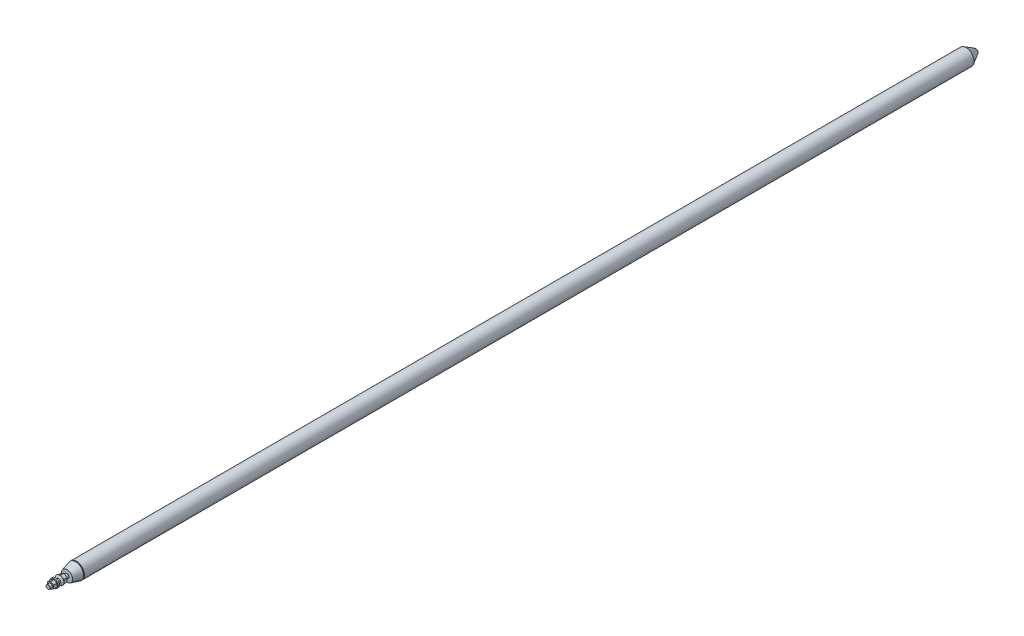
ISO-10303-21;
HEADER;
FILE_DESCRIPTION(('STEP AP214'),'2;1');
FILE_NAME('part.step','',(''),(''),'','','');
FILE_SCHEMA(('AUTOMOTIVE_DESIGN { 1 0 10303 214 1 1 1 1 }'));
ENDSEC;
DATA;
#1=APPLICATION_CONTEXT('core data for automotive mechanical design processes');
#2=APPLICATION_PROTOCOL_DEFINITION('international standard','automotive_design',2000,#1);
#3=PRODUCT_CONTEXT('',#1,'mechanical');
#4=PRODUCT('Part','Part','',(#3));
#5=PRODUCT_RELATED_PRODUCT_CATEGORY('part','',(#4));
#6=PRODUCT_DEFINITION_FORMATION('','',#4);
#7=PRODUCT_DEFINITION_CONTEXT('part definition',#1,'design');
#8=PRODUCT_DEFINITION('design','',#6,#7);
#9=PRODUCT_DEFINITION_SHAPE('','',#8);
#10=(LENGTH_UNIT() NAMED_UNIT(*) SI_UNIT(.MILLI.,.METRE.));
#11=(NAMED_UNIT(*) PLANE_ANGLE_UNIT() SI_UNIT($,.RADIAN.));
#12=(NAMED_UNIT(*) SI_UNIT($,.STERADIAN.) SOLID_ANGLE_UNIT());
#13=UNCERTAINTY_MEASURE_WITH_UNIT(LENGTH_MEASURE(1.E-05),#10,'distance_accuracy_value','');
#14=(GEOMETRIC_REPRESENTATION_CONTEXT(3) GLOBAL_UNCERTAINTY_ASSIGNED_CONTEXT((#13)) GLOBAL_UNIT_ASSIGNED_CONTEXT((#10,
#11,#12)) REPRESENTATION_CONTEXT('',''));
#15=CARTESIAN_POINT('',(0.,0.,0.));
#16=DIRECTION('',(0.,0.,1.));
#17=DIRECTION('',(1.,0.,0.));
#18=AXIS2_PLACEMENT_3D('',#15,#16,#17);
#19=CARTESIAN_POINT('',(0.,16.6751,52.1089983991226));
#20=DIRECTION('',(0.,0.,1.));
#21=DIRECTION('',(1.,0.,0.));
#22=AXIS2_PLACEMENT_3D('',#19,#20,#21);
#23=PLANE('',#22);
#24=CARTESIAN_POINT('',(0.,0.,52.1089983991226));
#25=DIRECTION('',(0.,0.,-1.));
#26=DIRECTION('',(-1.,0.,0.));
#27=AXIS2_PLACEMENT_3D('',#24,#25,#26);
#28=CIRCLE('',#27,16.6751);
#29=CARTESIAN_POINT('',(-16.6751,0.,52.1089983991226));
#30=VERTEX_POINT('',#29);
#31=EDGE_CURVE('E149',#30,#30,#28,.T.);
#32=ORIENTED_EDGE('',*,*,#31,.F.);
#33=EDGE_LOOP('',(#32));
#34=FACE_BOUND('',#33,.T.);
#35=DIRECTION('',(0.866025403784438,0.5,0.));
#36=VECTOR('',#35,1.);
#37=CARTESIAN_POINT('',(0.,-13.7554856334967,52.1089983991226));
#38=LINE('',#37,#36);
#39=CARTESIAN_POINT('',(0.,-13.7554856334967,52.1089983991226));
#40=VERTEX_POINT('',#39);
#41=CARTESIAN_POINT('',(11.9126,-6.87774281674833,52.1089983991226));
#42=VERTEX_POINT('',#41);
#43=EDGE_CURVE('E626',#40,#42,#38,.T.);
#44=ORIENTED_EDGE('',*,*,#43,.F.);
#45=DIRECTION('',(0.866025403784439,-0.499999999999999,0.));
#46=VECTOR('',#45,1.);
#47=CARTESIAN_POINT('',(-11.9126,-6.87774281674834,52.1089983991226));
#48=LINE('',#47,#46);
#49=CARTESIAN_POINT('',(-11.9126,-6.87774281674834,52.1089983991226));
#50=VERTEX_POINT('',#49);
#51=EDGE_CURVE('E147',#50,#40,#48,.T.);
#52=ORIENTED_EDGE('',*,*,#51,.F.);
#53=DIRECTION('',(0.,-1.,0.));
#54=VECTOR('',#53,1.);
#55=CARTESIAN_POINT('',(-11.9126,6.87774281674833,52.1089983991226));
#56=LINE('',#55,#54);
#57=CARTESIAN_POINT('',(-11.9126,6.87774281674833,52.1089983991226));
#58=VERTEX_POINT('',#57);
#59=EDGE_CURVE('E143',#58,#50,#56,.T.);
#60=ORIENTED_EDGE('',*,*,#59,.F.);
#61=DIRECTION('',(-0.866025403784439,-0.5,0.));
#62=VECTOR('',#61,1.);
#63=CARTESIAN_POINT('',(0.,13.7554856334967,52.1089983991226));
#64=LINE('',#63,#62);
#65=CARTESIAN_POINT('',(0.,13.7554856334967,52.1089983991226));
#66=VERTEX_POINT('',#65);
#67=EDGE_CURVE('E622',#66,#58,#64,.T.);
#68=ORIENTED_EDGE('',*,*,#67,.F.);
#69=DIRECTION('',(-0.866025403784439,0.5,0.));
#70=VECTOR('',#69,1.);
#71=CARTESIAN_POINT('',(11.9126,6.87774281674833,52.1089983991226));
#72=LINE('',#71,#70);
#73=CARTESIAN_POINT('',(11.9126,6.87774281674833,52.1089983991226));
#74=VERTEX_POINT('',#73);
#75=EDGE_CURVE('E634',#74,#66,#72,.T.);
#76=ORIENTED_EDGE('',*,*,#75,.F.);
#77=DIRECTION('',(0.,1.,0.));
#78=VECTOR('',#77,1.);
#79=CARTESIAN_POINT('',(11.9126,-6.87774281674833,52.1089983991226));
#80=LINE('',#79,#78);
#81=EDGE_CURVE('E628',#42,#74,#80,.T.);
#82=ORIENTED_EDGE('',*,*,#81,.F.);
#83=EDGE_LOOP('',(#44,#52,#60,#68,#76,#82));
#84=FACE_BOUND('',#83,.T.);
#85=ADVANCED_FACE('F33',(#34,#84),#23,.T.);
#86=CARTESIAN_POINT('',(0.,0.,0.));
#87=DIRECTION('',(0.,0.,-1.));
#88=DIRECTION('',(-1.,0.,0.));
#89=AXIS2_PLACEMENT_3D('',#86,#87,#88);
#90=CYLINDRICAL_SURFACE('',#89,7.93749999999999);
#91=CARTESIAN_POINT('',(0.,0.,46.2923983991226));
#92=DIRECTION('',(0.,0.,-1.));
#93=DIRECTION('',(-1.,0.,0.));
#94=AXIS2_PLACEMENT_3D('',#91,#92,#93);
#95=CIRCLE('',#94,7.93749999999999);
#96=CARTESIAN_POINT('',(-7.93749999999999,0.,46.2923983991226));
#97=VERTEX_POINT('',#96);
#98=EDGE_CURVE('E42',#97,#97,#95,.F.);
#99=ORIENTED_EDGE('',*,*,#98,.F.);
#100=EDGE_LOOP('',(#99));
#101=FACE_BOUND('',#100,.T.);
#102=CARTESIAN_POINT('',(0.,0.,33.5923983991226));
#103=DIRECTION('',(0.,0.,-1.));
#104=DIRECTION('',(-1.,0.,0.));
#105=AXIS2_PLACEMENT_3D('',#102,#103,#104);
#106=CIRCLE('',#105,7.93749999999999);
#107=CARTESIAN_POINT('',(0.,7.93749999999996,33.5923983991227));
#108=VERTEX_POINT('',#107);
#109=EDGE_CURVE('E236',#108,#108,#106,.T.);
#110=ORIENTED_EDGE('',*,*,#109,.F.);
#111=EDGE_LOOP('',(#110));
#112=FACE_BOUND('',#111,.T.);
#113=ADVANCED_FACE('F248',(#101,#112),#90,.T.);
#114=CARTESIAN_POINT('',(0.,0.,0.));
#115=DIRECTION('',(0.,0.,-1.));
#116=DIRECTION('',(-1.,0.,0.));
#117=AXIS2_PLACEMENT_3D('',#114,#115,#116);
#118=CIRCLE('',#117,7.93749999999999);
#119=CARTESIAN_POINT('',(-7.93749999999999,0.,0.));
#120=VERTEX_POINT('',#119);
#121=EDGE_CURVE('E224',#120,#120,#118,.T.);
#122=ORIENTED_EDGE('',*,*,#121,.F.);
#123=EDGE_LOOP('',(#122));
#124=FACE_BOUND('',#123,.T.);
#125=CARTESIAN_POINT('',(0.,0.,12.690475));
#126=DIRECTION('',(0.,0.,1.));
#127=DIRECTION('',(1.,0.,0.));
#128=AXIS2_PLACEMENT_3D('',#125,#126,#127);
#129=CIRCLE('',#128,7.93749999999999);
#130=CARTESIAN_POINT('',(7.93749999999999,0.,12.690475));
#131=VERTEX_POINT('',#130);
#132=EDGE_CURVE('E201',#131,#131,#129,.F.);
#133=ORIENTED_EDGE('',*,*,#132,.T.);
#134=EDGE_LOOP('',(#133));
#135=FACE_BOUND('',#134,.T.);
#136=ADVANCED_FACE('F251',(#124,#135),#90,.T.);
#137=CARTESIAN_POINT('',(0.,0.,-38.1));
#138=DIRECTION('',(0.,0.,1.));
#139=DIRECTION('',(1.,0.,0.));
#140=AXIS2_PLACEMENT_3D('',#137,#138,#139);
#141=CONICAL_SURFACE('',#140,28.575,0.780728808749583);
#142=CARTESIAN_POINT('',(0.,0.,-34.8952102827305));
#143=DIRECTION('',(0.,0.,-1.));
#144=DIRECTION('',(-1.,0.,0.));
#145=AXIS2_PLACEMENT_3D('',#142,#143,#144);
#146=CIRCLE('',#145,31.75);
#147=CARTESIAN_POINT('',(-31.75,0.,-34.8952102827305));
#148=VERTEX_POINT('',#147);
#149=EDGE_CURVE('E230',#148,#148,#146,.T.);
#150=ORIENTED_EDGE('',*,*,#149,.T.);
#151=EDGE_LOOP('',(#150));
#152=FACE_BOUND('',#151,.T.);
#153=CARTESIAN_POINT('',(0.,0.,-38.1));
#154=DIRECTION('',(0.,0.,-1.));
#155=DIRECTION('',(-1.,0.,0.));
#156=AXIS2_PLACEMENT_3D('',#153,#154,#155);
#157=CIRCLE('',#156,28.575);
#158=CARTESIAN_POINT('',(-28.575,0.,-38.1));
#159=VERTEX_POINT('',#158);
#160=EDGE_CURVE('E233',#159,#159,#157,.T.);
#161=ORIENTED_EDGE('',*,*,#160,.F.);
#162=EDGE_LOOP('',(#161));
#163=FACE_BOUND('',#162,.T.);
#164=ADVANCED_FACE('F454',(#152,#163),#141,.T.);
#165=CARTESIAN_POINT('',(0.,0.,-34.8952102827305));
#166=DIRECTION('',(0.,0.,-1.));
#167=DIRECTION('',(-1.,0.,0.));
#168=AXIS2_PLACEMENT_3D('',#165,#166,#167);
#169=CONICAL_SURFACE('',#168,31.75,0.266468742447018);
#170=CARTESIAN_POINT('',(0.,0.,0.));
#171=DIRECTION('',(0.,0.,-1.));
#172=DIRECTION('',(-1.,0.,0.));
#173=AXIS2_PLACEMENT_3D('',#170,#171,#172);
#174=CIRCLE('',#173,22.225);
#175=CARTESIAN_POINT('',(-22.225,0.,0.));
#176=VERTEX_POINT('',#175);
#177=EDGE_CURVE('E227',#176,#176,#174,.T.);
#178=ORIENTED_EDGE('',*,*,#177,.T.);
#179=EDGE_LOOP('',(#178));
#180=FACE_BOUND('',#179,.T.);
#181=ORIENTED_EDGE('',*,*,#149,.F.);
#182=EDGE_LOOP('',(#181));
#183=FACE_BOUND('',#182,.T.);
#184=ADVANCED_FACE('F540',(#180,#183),#169,.T.);
#185=CARTESIAN_POINT('',(0.,7.93749999999999,0.));
#186=DIRECTION('',(0.,0.,1.));
#187=DIRECTION('',(1.,0.,0.));
#188=AXIS2_PLACEMENT_3D('',#185,#186,#187);
#189=PLANE('',#188);
#190=ORIENTED_EDGE('',*,*,#121,.T.);
#191=EDGE_LOOP('',(#190));
#192=FACE_BOUND('',#191,.T.);
#193=ORIENTED_EDGE('',*,*,#177,.F.);
#194=EDGE_LOOP('',(#193));
#195=FACE_BOUND('',#194,.T.);
#196=ADVANCED_FACE('F527',(#192,#195),#189,.T.);
#197=CARTESIAN_POINT('',(0.,31.75,-38.1));
#198=DIRECTION('',(0.,0.,-1.));
#199=DIRECTION('',(-1.,0.,0.));
#200=AXIS2_PLACEMENT_3D('',#197,#198,#199);
#201=PLANE('',#200);
#202=ORIENTED_EDGE('',*,*,#160,.T.);
#203=EDGE_LOOP('',(#202));
#204=FACE_BOUND('',#203,.T.);
#205=CARTESIAN_POINT('',(0.,0.,-38.1));
#206=DIRECTION('',(0.,0.,1.));
#207=DIRECTION('',(1.,0.,0.));
#208=AXIS2_PLACEMENT_3D('',#205,#206,#207);
#209=CIRCLE('',#208,31.75);
#210=CARTESIAN_POINT('',(31.75,0.,-38.1));
#211=VERTEX_POINT('',#210);
#212=EDGE_CURVE('E205',#211,#211,#209,.T.);
#213=ORIENTED_EDGE('',*,*,#212,.T.);
#214=EDGE_LOOP('',(#213));
#215=FACE_BOUND('',#214,.T.);
#216=ADVANCED_FACE('F523',(#204,#215),#201,.F.);
#217=CARTESIAN_POINT('',(0.,0.,29.7434));
#218=DIRECTION('',(0.,0.,1.));
#219=DIRECTION('',(1.,0.,0.));
#220=AXIS2_PLACEMENT_3D('',#217,#218,#219);
#221=CYLINDRICAL_SURFACE('',#220,31.75);
#222=ORIENTED_EDGE('',*,*,#212,.F.);
#223=EDGE_LOOP('',(#222));
#224=FACE_BOUND('',#223,.T.);
#225=CARTESIAN_POINT('',(0.,0.,-3603.43540844997));
#226=DIRECTION('',(0.,0.,1.));
#227=DIRECTION('',(1.,0.,0.));
#228=AXIS2_PLACEMENT_3D('',#225,#226,#227);
#229=CIRCLE('',#228,31.75);
#230=CARTESIAN_POINT('',(31.75,0.,-3603.43540844997));
#231=VERTEX_POINT('',#230);
#232=EDGE_CURVE('E208',#231,#231,#229,.T.);
#233=ORIENTED_EDGE('',*,*,#232,.T.);
#234=EDGE_LOOP('',(#233));
#235=FACE_BOUND('',#234,.T.);
#236=ADVANCED_FACE('F526',(#224,#235),#221,.T.);
#237=CARTESIAN_POINT('',(0.,0.,-3639.37802159028));
#238=DIRECTION('',(0.,0.,1.));
#239=DIRECTION('',(1.,0.,0.));
#240=AXIS2_PLACEMENT_3D('',#237,#238,#239);
#241=CONICAL_SURFACE('',#240,10.9985226280624,0.523598775598293);
#242=ORIENTED_EDGE('',*,*,#232,.F.);
#243=EDGE_LOOP('',(#242));
#244=FACE_BOUND('',#243,.T.);
#245=CARTESIAN_POINT('',(0.,0.,-3639.37802159028));
#246=DIRECTION('',(0.,0.,1.));
#247=DIRECTION('',(1.,0.,0.));
#248=AXIS2_PLACEMENT_3D('',#245,#246,#247);
#249=CIRCLE('',#248,10.9985226280624);
#250=CARTESIAN_POINT('',(10.9985226280624,0.,-3639.37802159028));
#251=VERTEX_POINT('',#250);
#252=EDGE_CURVE('E211',#251,#251,#249,.T.);
#253=ORIENTED_EDGE('',*,*,#252,.T.);
#254=EDGE_LOOP('',(#253));
#255=FACE_BOUND('',#254,.T.);
#256=ADVANCED_FACE('F531',(#244,#255),#241,.T.);
#257=CARTESIAN_POINT('',(0.,0.,-3633.02802159028));
#258=DIRECTION('',(0.,0.,1.));
#259=DIRECTION('',(0.,1.,0.));
#260=AXIS2_PLACEMENT_3D('',#257,#258,#259);
#261=SPHERICAL_SURFACE('',#260,12.7000000000001);
#262=ORIENTED_EDGE('',*,*,#252,.F.);
#263=EDGE_LOOP('',(#262));
#264=FACE_BOUND('',#263,.T.);
#265=ADVANCED_FACE('F464',(#264),#261,.T.);
#266=CARTESIAN_POINT('',(13.5001,-7.79428636908687,12.690475));
#267=DIRECTION('',(-0.499999999999999,0.866025403784439,0.));
#268=DIRECTION('',(-0.866025403784439,-0.5,0.));
#269=AXIS2_PLACEMENT_3D('',#266,#267,#268);
#270=PLANE('',#269);
#271=DIRECTION('',(-0.866025403784439,-0.499999999999999,0.));
#272=VECTOR('',#271,1.);
#273=CARTESIAN_POINT('',(13.5001,-7.79428636908687,28.1686));
#274=LINE('',#273,#272);
#275=CARTESIAN_POINT('',(13.5001,-7.79428636908687,28.1686));
#276=VERTEX_POINT('',#275);
#277=CARTESIAN_POINT('',(0.,-15.5885727381737,28.1686));
#278=VERTEX_POINT('',#277);
#279=EDGE_CURVE('E160',#276,#278,#274,.T.);
#280=ORIENTED_EDGE('',*,*,#279,.T.);
#281=DIRECTION('',(0.,0.,1.));
#282=VECTOR('',#281,1.);
#283=CARTESIAN_POINT('',(0.,-15.5885727381737,12.690475));
#284=LINE('',#283,#282);
#285=CARTESIAN_POINT('',(0.,-15.5885727381737,12.690475));
#286=VERTEX_POINT('',#285);
#287=EDGE_CURVE('E199',#286,#278,#284,.T.);
#288=ORIENTED_EDGE('',*,*,#287,.F.);
#289=DIRECTION('',(-0.866025403784439,-0.499999999999999,0.));
#290=VECTOR('',#289,1.);
#291=CARTESIAN_POINT('',(13.5001,-7.79428636908687,12.690475));
#292=LINE('',#291,#290);
#293=CARTESIAN_POINT('',(13.5001,-7.79428636908687,12.690475));
#294=VERTEX_POINT('',#293);
#295=EDGE_CURVE('E161',#294,#286,#292,.T.);
#296=ORIENTED_EDGE('',*,*,#295,.F.);
#297=DIRECTION('',(0.,0.,1.));
#298=VECTOR('',#297,1.);
#299=CARTESIAN_POINT('',(13.5001,-7.79428636908687,12.690475));
#300=LINE('',#299,#298);
#301=EDGE_CURVE('E175',#294,#276,#300,.T.);
#302=ORIENTED_EDGE('',*,*,#301,.T.);
#303=EDGE_LOOP('',(#280,#288,#296,#302));
#304=FACE_BOUND('',#303,.T.);
#305=ADVANCED_FACE('F292',(#304),#270,.F.);
#306=CARTESIAN_POINT('',(0.,-15.5885727381737,12.690475));
#307=DIRECTION('',(0.5,0.866025403784438,0.));
#308=DIRECTION('',(-0.866025403784438,0.5,0.));
#309=AXIS2_PLACEMENT_3D('',#306,#307,#308);
#310=PLANE('',#309);
#311=DIRECTION('',(-0.866025403784438,0.5,0.));
#312=VECTOR('',#311,1.);
#313=CARTESIAN_POINT('',(0.,-15.5885727381737,28.1686));
#314=LINE('',#313,#312);
#315=CARTESIAN_POINT('',(-13.5001,-7.79428636908686,28.1686));
#316=VERTEX_POINT('',#315);
#317=EDGE_CURVE('E178',#278,#316,#314,.T.);
#318=ORIENTED_EDGE('',*,*,#317,.T.);
#319=DIRECTION('',(0.,0.,1.));
#320=VECTOR('',#319,1.);
#321=CARTESIAN_POINT('',(-13.5001,-7.79428636908686,12.690475));
#322=LINE('',#321,#320);
#323=CARTESIAN_POINT('',(-13.5001,-7.79428636908686,12.690475));
#324=VERTEX_POINT('',#323);
#325=EDGE_CURVE('E196',#324,#316,#322,.T.);
#326=ORIENTED_EDGE('',*,*,#325,.F.);
#327=DIRECTION('',(-0.866025403784438,0.5,0.));
#328=VECTOR('',#327,1.);
#329=CARTESIAN_POINT('',(0.,-15.5885727381737,12.690475));
#330=LINE('',#329,#328);
#331=EDGE_CURVE('E164',#286,#324,#330,.T.);
#332=ORIENTED_EDGE('',*,*,#331,.F.);
#333=ORIENTED_EDGE('',*,*,#287,.T.);
#334=EDGE_LOOP('',(#318,#326,#332,#333));
#335=FACE_BOUND('',#334,.T.);
#336=ADVANCED_FACE('F280',(#335),#310,.F.);
#337=CARTESIAN_POINT('',(-13.5001,-7.79428636908686,12.690475));
#338=DIRECTION('',(1.,0.,0.));
#339=DIRECTION('',(0.,1.,0.));
#340=AXIS2_PLACEMENT_3D('',#337,#338,#339);
#341=PLANE('',#340);
#342=DIRECTION('',(0.,1.,0.));
#343=VECTOR('',#342,1.);
#344=CARTESIAN_POINT('',(-13.5001,-7.79428636908686,28.1686));
#345=LINE('',#344,#343);
#346=CARTESIAN_POINT('',(-13.5001,7.79428636908686,28.1686));
#347=VERTEX_POINT('',#346);
#348=EDGE_CURVE('E180',#316,#347,#345,.T.);
#349=ORIENTED_EDGE('',*,*,#348,.T.);
#350=DIRECTION('',(0.,0.,1.));
#351=VECTOR('',#350,1.);
#352=CARTESIAN_POINT('',(-13.5001,7.79428636908686,12.690475));
#353=LINE('',#352,#351);
#354=CARTESIAN_POINT('',(-13.5001,7.79428636908686,12.690475));
#355=VERTEX_POINT('',#354);
#356=EDGE_CURVE('E193',#355,#347,#353,.T.);
#357=ORIENTED_EDGE('',*,*,#356,.F.);
#358=DIRECTION('',(0.,1.,0.));
#359=VECTOR('',#358,1.);
#360=CARTESIAN_POINT('',(-13.5001,-7.79428636908686,12.690475));
#361=LINE('',#360,#359);
#362=EDGE_CURVE('E167',#324,#355,#361,.T.);
#363=ORIENTED_EDGE('',*,*,#362,.F.);
#364=ORIENTED_EDGE('',*,*,#325,.T.);
#365=EDGE_LOOP('',(#349,#357,#363,#364));
#366=FACE_BOUND('',#365,.T.);
#367=ADVANCED_FACE('F284',(#366),#341,.F.);
#368=CARTESIAN_POINT('',(-13.5001,7.79428636908686,12.690475));
#369=DIRECTION('',(0.5,-0.866025403784439,0.));
#370=DIRECTION('',(0.866025403784439,0.5,0.));
#371=AXIS2_PLACEMENT_3D('',#368,#369,#370);
#372=PLANE('',#371);
#373=DIRECTION('',(0.866025403784439,0.5,0.));
#374=VECTOR('',#373,1.);
#375=CARTESIAN_POINT('',(-13.5001,7.79428636908686,28.1686));
#376=LINE('',#375,#374);
#377=CARTESIAN_POINT('',(0.,15.5885727381737,28.1686));
#378=VERTEX_POINT('',#377);
#379=EDGE_CURVE('E182',#347,#378,#376,.T.);
#380=ORIENTED_EDGE('',*,*,#379,.T.);
#381=DIRECTION('',(0.,0.,1.));
#382=VECTOR('',#381,1.);
#383=CARTESIAN_POINT('',(0.,15.5885727381737,12.690475));
#384=LINE('',#383,#382);
#385=CARTESIAN_POINT('',(0.,15.5885727381737,12.690475));
#386=VERTEX_POINT('',#385);
#387=EDGE_CURVE('E190',#386,#378,#384,.T.);
#388=ORIENTED_EDGE('',*,*,#387,.F.);
#389=DIRECTION('',(0.866025403784439,0.5,0.));
#390=VECTOR('',#389,1.);
#391=CARTESIAN_POINT('',(-13.5001,7.79428636908686,12.690475));
#392=LINE('',#391,#390);
#393=EDGE_CURVE('E169',#355,#386,#392,.T.);
#394=ORIENTED_EDGE('',*,*,#393,.F.);
#395=ORIENTED_EDGE('',*,*,#356,.T.);
#396=EDGE_LOOP('',(#380,#388,#394,#395));
#397=FACE_BOUND('',#396,.T.);
#398=ADVANCED_FACE('F299',(#397),#372,.F.);
#399=CARTESIAN_POINT('',(0.,15.5885727381737,12.690475));
#400=DIRECTION('',(-0.5,-0.866025403784438,0.));
#401=DIRECTION('',(0.866025403784439,-0.5,0.));
#402=AXIS2_PLACEMENT_3D('',#399,#400,#401);
#403=PLANE('',#402);
#404=DIRECTION('',(0.866025403784438,-0.5,0.));
#405=VECTOR('',#404,1.);
#406=CARTESIAN_POINT('',(0.,15.5885727381737,28.1686));
#407=LINE('',#406,#405);
#408=CARTESIAN_POINT('',(13.5001,7.79428636908686,28.1686));
#409=VERTEX_POINT('',#408);
#410=EDGE_CURVE('E184',#378,#409,#407,.T.);
#411=ORIENTED_EDGE('',*,*,#410,.T.);
#412=DIRECTION('',(0.,0.,1.));
#413=VECTOR('',#412,1.);
#414=CARTESIAN_POINT('',(13.5001,7.79428636908686,12.690475));
#415=LINE('',#414,#413);
#416=CARTESIAN_POINT('',(13.5001,7.79428636908686,12.690475));
#417=VERTEX_POINT('',#416);
#418=EDGE_CURVE('E57',#417,#409,#415,.T.);
#419=ORIENTED_EDGE('',*,*,#418,.F.);
#420=DIRECTION('',(0.866025403784438,-0.5,0.));
#421=VECTOR('',#420,1.);
#422=CARTESIAN_POINT('',(0.,15.5885727381737,12.690475));
#423=LINE('',#422,#421);
#424=EDGE_CURVE('E171',#386,#417,#423,.T.);
#425=ORIENTED_EDGE('',*,*,#424,.F.);
#426=ORIENTED_EDGE('',*,*,#387,.T.);
#427=EDGE_LOOP('',(#411,#419,#425,#426));
#428=FACE_BOUND('',#427,.T.);
#429=ADVANCED_FACE('F296',(#428),#403,.F.);
#430=CARTESIAN_POINT('',(13.5001,7.79428636908686,12.690475));
#431=DIRECTION('',(-1.,0.,0.));
#432=DIRECTION('',(0.,0.,1.));
#433=AXIS2_PLACEMENT_3D('',#430,#431,#432);
#434=PLANE('',#433);
#435=DIRECTION('',(0.,-1.,0.));
#436=VECTOR('',#435,1.);
#437=CARTESIAN_POINT('',(13.5001,7.79428636908686,28.1686));
#438=LINE('',#437,#436);
#439=EDGE_CURVE('E165',#409,#276,#438,.T.);
#440=ORIENTED_EDGE('',*,*,#439,.T.);
#441=ORIENTED_EDGE('',*,*,#301,.F.);
#442=DIRECTION('',(0.,-1.,0.));
#443=VECTOR('',#442,1.);
#444=CARTESIAN_POINT('',(13.5001,7.79428636908686,12.690475));
#445=LINE('',#444,#443);
#446=EDGE_CURVE('E173',#417,#294,#445,.T.);
#447=ORIENTED_EDGE('',*,*,#446,.F.);
#448=ORIENTED_EDGE('',*,*,#418,.T.);
#449=EDGE_LOOP('',(#440,#441,#447,#448));
#450=FACE_BOUND('',#449,.T.);
#451=ADVANCED_FACE('F293',(#450),#434,.F.);
#452=CARTESIAN_POINT('',(13.5001,-7.79428636908687,12.690475));
#453=DIRECTION('',(0.,0.,1.));
#454=DIRECTION('',(1.,0.,0.));
#455=AXIS2_PLACEMENT_3D('',#452,#453,#454);
#456=PLANE('',#455);
#457=ORIENTED_EDGE('',*,*,#132,.F.);
#458=EDGE_LOOP('',(#457));
#459=FACE_BOUND('',#458,.T.);
#460=ORIENTED_EDGE('',*,*,#295,.T.);
#461=ORIENTED_EDGE('',*,*,#331,.T.);
#462=ORIENTED_EDGE('',*,*,#362,.T.);
#463=ORIENTED_EDGE('',*,*,#393,.T.);
#464=ORIENTED_EDGE('',*,*,#424,.T.);
#465=ORIENTED_EDGE('',*,*,#446,.T.);
#466=EDGE_LOOP('',(#460,#461,#462,#463,#464,#465));
#467=FACE_BOUND('',#466,.T.);
#468=ADVANCED_FACE('F260',(#459,#467),#456,.F.);
#469=CARTESIAN_POINT('',(0.,0.,0.0435161764705885));
#470=DIRECTION('',(0.,0.,-1.));
#471=DIRECTION('',(0.,1.,0.));
#472=AXIS2_PLACEMENT_3D('',#469,#470,#471);
#473=SPHERICAL_SURFACE('',#472,34.4750838235294);
#474=CARTESIAN_POINT('',(0.,0.,29.7688));
#475=DIRECTION('',(0.,0.,-1.));
#476=DIRECTION('',(-1.,0.,0.));
#477=AXIS2_PLACEMENT_3D('',#474,#475,#476);
#478=CIRCLE('',#477,17.4625);
#479=CARTESIAN_POINT('',(0.,17.4625,29.7688));
#480=VERTEX_POINT('',#479);
#481=EDGE_CURVE('E215',#480,#480,#478,.T.);
#482=CARTESIAN_POINT('',(0.,7.93749999999996,33.5923983991227));
#483=CARTESIAN_POINT('',(0.,8.04193033230631,33.5676907138939));
#484=CARTESIAN_POINT('',(0.,8.14624529277318,33.5424953955937));
#485=CARTESIAN_POINT('',(0.,8.35463538983752,33.4911317569022));
#486=CARTESIAN_POINT('',(0.,8.458710526435,33.464963436511));
#487=CARTESIAN_POINT('',(0.,8.66661189557016,33.4116560576896));
#488=CARTESIAN_POINT('',(0.,8.77043812810784,33.3845169992594));
#489=CARTESIAN_POINT('',(0.,8.97783263624223,33.3292705157999));
#490=CARTESIAN_POINT('',(0.,9.08140091183892,33.3011630907704));
#491=CARTESIAN_POINT('',(0.,9.28827047420351,33.2439823239056));
#492=CARTESIAN_POINT('',(0.,9.39157176097139,33.2149089820701));
#493=CARTESIAN_POINT('',(0.,9.59789833747534,33.1557989172506));
#494=CARTESIAN_POINT('',(0.,9.7009236272114,33.1257621942665));
#495=CARTESIAN_POINT('',(0.,9.90668922540895,33.0647279863804));
#496=CARTESIAN_POINT('',(0.,10.0094295338704,33.0337305014784));
#497=CARTESIAN_POINT('',(0.,10.2146162101565,32.9707774728867));
#498=CARTESIAN_POINT('',(0.,10.3170625779811,32.938821929197));
#499=CARTESIAN_POINT('',(0.,10.521652439256,32.8739555696753));
#500=CARTESIAN_POINT('',(0.,10.6237959327063,32.8410447538433));
#501=CARTESIAN_POINT('',(0.,10.8277711379095,32.7742707199945));
#502=CARTESIAN_POINT('',(0.,10.9296028496623,32.7404075019776));
#503=CARTESIAN_POINT('',(0.,11.132945611335,32.6717316167674));
#504=CARTESIAN_POINT('',(0.,11.234456661255,32.636918949574));
#505=CARTESIAN_POINT('',(0.,11.4371492470899,32.5663472018157));
#506=CARTESIAN_POINT('',(0.,11.5383307830049,32.5305881212508));
#507=CARTESIAN_POINT('',(0.,11.7403555173927,32.458126665085));
#508=CARTESIAN_POINT('',(0.,11.8411987158655,32.4214242894841));
#509=CARTESIAN_POINT('',(0.,12.042537981436,32.3470794438415));
#510=CARTESIAN_POINT('',(0.,12.1430340485337,32.3094369737997));
#511=CARTESIAN_POINT('',(0.,12.3436702876927,32.2332152218499));
#512=CARTESIAN_POINT('',(0.,12.4438104597538,32.194635939942));
#513=CARTESIAN_POINT('',(0.,12.6437261762134,32.1165439285288));
#514=CARTESIAN_POINT('',(0.,12.7435017206118,32.0770311990235));
#515=CARTESIAN_POINT('',(0.,12.9426794809169,31.9970757380846));
#516=CARTESIAN_POINT('',(0.,13.0420816968236,31.956633006651));
#517=CARTESIAN_POINT('',(0.,13.2405041318717,31.8748210686243));
#518=CARTESIAN_POINT('',(0.,13.3395243510132,31.8334518620313));
#519=CARTESIAN_POINT('',(0.,13.5371741575694,31.7497905812473));
#520=CARTESIAN_POINT('',(0.,13.6358037449841,31.7074985070563));
#521=CARTESIAN_POINT('',(0.,13.8326636871895,31.6219951791153));
#522=CARTESIAN_POINT('',(0.,13.9308940419803,31.5787839253653));
#523=CARTESIAN_POINT('',(0.,14.1269469528556,31.4914460065018));
#524=CARTESIAN_POINT('',(0.,14.2247695089402,31.4473193413882));
#525=CARTESIAN_POINT('',(0.,14.4199982918825,31.3581544478201));
#526=CARTESIAN_POINT('',(0.,14.5174045187402,31.3131162193657));
#527=CARTESIAN_POINT('',(0.,14.7117921490136,31.2221321266308));
#528=CARTESIAN_POINT('',(0.,14.8087735524293,31.1761862623503));
#529=CARTESIAN_POINT('',(0.,15.0023030786502,31.0833909046278));
#530=CARTESIAN_POINT('',(0.,15.0988512014553,31.0365414111859));
#531=CARTESIAN_POINT('',(0.,15.2915057470694,30.9419428806036));
#532=CARTESIAN_POINT('',(0.,15.3876121698782,30.8941938434631));
#533=CARTESIAN_POINT('',(0.,15.579374934636,30.7978003893978));
#534=CARTESIAN_POINT('',(0.,15.675031276585,30.749155972473));
#535=CARTESIAN_POINT('',(0.,15.8658855379922,30.6509760008058));
#536=CARTESIAN_POINT('',(0.,15.9610834574505,30.6014404460634));
#537=CARTESIAN_POINT('',(0.,16.1510125722821,30.5014825185434));
#538=CARTESIAN_POINT('',(0.,16.2457437676554,30.4510601457658));
#539=CARTESIAN_POINT('',(0.,16.4347311731984,30.3493329789012));
#540=CARTESIAN_POINT('',(0.,16.5289873833681,30.2980281848143));
#541=CARTESIAN_POINT('',(0.,16.7170165996438,30.194540650465));
#542=CARTESIAN_POINT('',(0.,16.8107896057498,30.1423579102026));
#543=CARTESIAN_POINT('',(0.,16.9978442340481,30.0371190297578));
#544=CARTESIAN_POINT('',(0.,17.0911258562404,29.9840628895754));
#545=CARTESIAN_POINT('',(0.,17.2771895913833,29.877081852009));
#546=CARTESIAN_POINT('',(0.,17.369971704334,29.8231569546252));
#547=CARTESIAN_POINT('',(0.,17.4625,29.7688));
#548=B_SPLINE_CURVE_WITH_KNOTS('',3,(#482,#483,#484,#485,#486,#487,#488,#489,#490,#491,#492,
#493,#494,#495,#496,#497,#498,#499,#500,#501,#502,#503,#504,#505,#506,#507,#508,#509,#510,#511,
#512,#513,#514,#515,#516,#517,#518,#519,#520,#521,#522,#523,#524,#525,#526,#527,#528,#529,#530,
#531,#532,#533,#534,#535,#536,#537,#538,#539,#540,#541,#542,#543,#544,#545,#546,#547),
.UNSPECIFIED.,.F.,.F.,(4,2,2,2,2,2,2,2,2,2,2,2,2,2,2,2,2,2,2,2,2,2,2,2,2,2,2,2,2,2,2,2,4),(0.,
0.321939004572816,0.643878009145632,0.965817013718447,1.28775601829126,1.60969502286408,
1.9316340274369,2.25357303200971,2.57551203658253,2.89745104115534,3.21939004572815,
3.54132905030097,3.86326805487378,4.1852070594466,4.50714606401941,4.82908506859223,
5.15102407316505,5.47296307773786,5.79490208231068,6.11684108688349,6.43878009145631,
6.76071909602913,7.08265810060194,7.40459710517475,7.72653610974757,8.04847511432038,
8.3704141188932,8.69235312346602,9.01429212803883,9.33623113261165,9.65817013718446,
9.98010914175728,10.3020481463301),.UNSPECIFIED.);
#549=EDGE_CURVE('BSEAM256',#108,#480,#548,.T.);
#550=ORIENTED_EDGE('',*,*,#109,.T.);
#551=ORIENTED_EDGE('',*,*,#481,.F.);
#552=ORIENTED_EDGE('',*,*,#549,.T.);
#553=ORIENTED_EDGE('',*,*,#549,.F.);
#554=EDGE_LOOP('',(#550,#552,#551,#553));
#555=FACE_BOUND('',#554,.T.);
#556=ADVANCED_FACE('F256',(#555),#473,.T.);
#557=CARTESIAN_POINT('',(0.,0.,0.));
#558=DIRECTION('',(0.,0.,-1.));
#559=DIRECTION('',(-1.,0.,0.));
#560=AXIS2_PLACEMENT_3D('',#557,#558,#559);
#561=CYLINDRICAL_SURFACE('',#560,17.4625);
#562=ORIENTED_EDGE('',*,*,#481,.T.);
#563=EDGE_LOOP('',(#562));
#564=FACE_BOUND('',#563,.T.);
#565=CARTESIAN_POINT('',(0.,0.,28.1686));
#566=DIRECTION('',(0.,0.,-1.));
#567=DIRECTION('',(-1.,0.,0.));
#568=AXIS2_PLACEMENT_3D('',#565,#566,#567);
#569=CIRCLE('',#568,17.4625);
#570=CARTESIAN_POINT('',(-17.4625,0.,28.1686));
#571=VERTEX_POINT('',#570);
#572=EDGE_CURVE('E218',#571,#571,#569,.T.);
#573=ORIENTED_EDGE('',*,*,#572,.F.);
#574=EDGE_LOOP('',(#573));
#575=FACE_BOUND('',#574,.T.);
#576=ADVANCED_FACE('F259',(#564,#575),#561,.T.);
#577=CARTESIAN_POINT('',(0.,0.,28.1686));
#578=DIRECTION('',(0.,0.,-1.));
#579=DIRECTION('',(-1.,0.,0.));
#580=AXIS2_PLACEMENT_3D('',#577,#578,#579);
#581=PLANE('',#580);
#582=ORIENTED_EDGE('',*,*,#572,.T.);
#583=EDGE_LOOP('',(#582));
#584=FACE_BOUND('',#583,.T.);
#585=ORIENTED_EDGE('',*,*,#317,.F.);
#586=ORIENTED_EDGE('',*,*,#279,.F.);
#587=ORIENTED_EDGE('',*,*,#439,.F.);
#588=ORIENTED_EDGE('',*,*,#410,.F.);
#589=ORIENTED_EDGE('',*,*,#379,.F.);
#590=ORIENTED_EDGE('',*,*,#348,.F.);
#591=EDGE_LOOP('',(#585,#586,#587,#588,#589,#590));
#592=FACE_BOUND('',#591,.T.);
#593=ADVANCED_FACE('F266',(#584,#592),#581,.T.);
#594=CARTESIAN_POINT('',(0.,0.,46.2923983991226));
#595=DIRECTION('',(0.,0.,-1.));
#596=DIRECTION('',(-1.,0.,0.));
#597=AXIS2_PLACEMENT_3D('',#594,#595,#596);
#598=PLANE('',#597);
#599=ORIENTED_EDGE('',*,*,#98,.T.);
#600=EDGE_LOOP('',(#599));
#601=FACE_BOUND('',#600,.T.);
#602=CARTESIAN_POINT('',(0.,0.,46.2923983991226));
#603=DIRECTION('',(0.,0.,-1.));
#604=DIRECTION('',(-1.,0.,0.));
#605=AXIS2_PLACEMENT_3D('',#602,#603,#604);
#606=CIRCLE('',#605,16.6751);
#607=CARTESIAN_POINT('',(-16.6751,0.,46.2923983991226));
#608=VERTEX_POINT('',#607);
#609=EDGE_CURVE('E152',#608,#608,#606,.T.);
#610=ORIENTED_EDGE('',*,*,#609,.T.);
#611=EDGE_LOOP('',(#610));
#612=FACE_BOUND('',#611,.T.);
#613=ADVANCED_FACE('F245',(#601,#612),#598,.T.);
#614=CARTESIAN_POINT('',(0.,0.,0.));
#615=DIRECTION('',(0.,0.,-1.));
#616=DIRECTION('',(-1.,0.,0.));
#617=AXIS2_PLACEMENT_3D('',#614,#615,#616);
#618=CYLINDRICAL_SURFACE('',#617,16.6751);
#619=ORIENTED_EDGE('',*,*,#31,.T.);
#620=EDGE_LOOP('',(#619));
#621=FACE_BOUND('',#620,.T.);
#622=ORIENTED_EDGE('',*,*,#609,.F.);
#623=EDGE_LOOP('',(#622));
#624=FACE_BOUND('',#623,.T.);
#625=ADVANCED_FACE('F318',(#621,#624),#618,.T.);
#626=CARTESIAN_POINT('',(-11.9126,-6.87774281674834,65.9996233991226));
#627=DIRECTION('',(0.499999999999999,0.866025403784439,0.));
#628=DIRECTION('',(-0.866025403784439,0.499999999999999,0.));
#629=AXIS2_PLACEMENT_3D('',#626,#627,#628);
#630=PLANE('',#629);
#631=ORIENTED_EDGE('',*,*,#51,.T.);
#632=DIRECTION('',(0.,0.,-1.));
#633=VECTOR('',#632,1.);
#634=CARTESIAN_POINT('',(0.,-13.7554856334967,65.9996233991226));
#635=LINE('',#634,#633);
#636=CARTESIAN_POINT('',(0.,-13.7554856334967,65.9996233991226));
#637=VERTEX_POINT('',#636);
#638=EDGE_CURVE('E128',#637,#40,#635,.T.);
#639=ORIENTED_EDGE('',*,*,#638,.F.);
#640=DIRECTION('',(0.866025403784439,-0.499999999999999,0.));
#641=VECTOR('',#640,1.);
#642=CARTESIAN_POINT('',(-11.9126,-6.87774281674834,65.9996233991226));
#643=LINE('',#642,#641);
#644=CARTESIAN_POINT('',(-11.9126,-6.87774281674834,65.9996233991226));
#645=VERTEX_POINT('',#644);
#646=EDGE_CURVE('E135',#645,#637,#643,.T.);
#647=ORIENTED_EDGE('',*,*,#646,.F.);
#648=DIRECTION('',(0.,0.,-1.));
#649=VECTOR('',#648,1.);
#650=CARTESIAN_POINT('',(-11.9126,-6.87774281674834,65.9996233991226));
#651=LINE('',#650,#649);
#652=EDGE_CURVE('E620',#645,#50,#651,.T.);
#653=ORIENTED_EDGE('',*,*,#652,.T.);
#654=EDGE_LOOP('',(#631,#639,#647,#653));
#655=FACE_BOUND('',#654,.T.);
#656=ADVANCED_FACE('F145',(#655),#630,.F.);
#657=CARTESIAN_POINT('',(0.,-13.7554856334967,65.9996233991226));
#658=DIRECTION('',(-0.5,0.866025403784438,0.));
#659=DIRECTION('',(-0.866025403784438,-0.5,0.));
#660=AXIS2_PLACEMENT_3D('',#657,#658,#659);
#661=PLANE('',#660);
#662=ORIENTED_EDGE('',*,*,#43,.T.);
#663=DIRECTION('',(0.,0.,-1.));
#664=VECTOR('',#663,1.);
#665=CARTESIAN_POINT('',(11.9126,-6.87774281674833,65.9996233991226));
#666=LINE('',#665,#664);
#667=CARTESIAN_POINT('',(11.9126,-6.87774281674833,65.9996233991226));
#668=VERTEX_POINT('',#667);
#669=EDGE_CURVE('E131',#668,#42,#666,.T.);
#670=ORIENTED_EDGE('',*,*,#669,.F.);
#671=DIRECTION('',(0.866025403784438,0.5,0.));
#672=VECTOR('',#671,1.);
#673=CARTESIAN_POINT('',(0.,-13.7554856334967,65.9996233991226));
#674=LINE('',#673,#672);
#675=EDGE_CURVE('E124',#637,#668,#674,.T.);
#676=ORIENTED_EDGE('',*,*,#675,.F.);
#677=ORIENTED_EDGE('',*,*,#638,.T.);
#678=EDGE_LOOP('',(#662,#670,#676,#677));
#679=FACE_BOUND('',#678,.T.);
#680=ADVANCED_FACE('F126',(#679),#661,.F.);
#681=CARTESIAN_POINT('',(11.9126,-6.87774281674833,65.9996233991226));
#682=DIRECTION('',(-1.,0.,0.));
#683=DIRECTION('',(0.,-1.,0.));
#684=AXIS2_PLACEMENT_3D('',#681,#682,#683);
#685=PLANE('',#684);
#686=ORIENTED_EDGE('',*,*,#81,.T.);
#687=DIRECTION('',(0.,0.,-1.));
#688=VECTOR('',#687,1.);
#689=CARTESIAN_POINT('',(11.9126,6.87774281674833,65.9996233991226));
#690=LINE('',#689,#688);
#691=CARTESIAN_POINT('',(11.9126,6.87774281674833,65.9996233991226));
#692=VERTEX_POINT('',#691);
#693=EDGE_CURVE('E154',#692,#74,#690,.T.);
#694=ORIENTED_EDGE('',*,*,#693,.F.);
#695=DIRECTION('',(0.,1.,0.));
#696=VECTOR('',#695,1.);
#697=CARTESIAN_POINT('',(11.9126,-6.87774281674833,65.9996233991226));
#698=LINE('',#697,#696);
#699=EDGE_CURVE('E134',#668,#692,#698,.T.);
#700=ORIENTED_EDGE('',*,*,#699,.F.);
#701=ORIENTED_EDGE('',*,*,#669,.T.);
#702=EDGE_LOOP('',(#686,#694,#700,#701));
#703=FACE_BOUND('',#702,.T.);
#704=ADVANCED_FACE('F370',(#703),#685,.F.);
#705=CARTESIAN_POINT('',(11.9126,6.87774281674833,65.9996233991226));
#706=DIRECTION('',(-0.5,-0.866025403784439,0.));
#707=DIRECTION('',(0.866025403784439,-0.5,0.));
#708=AXIS2_PLACEMENT_3D('',#705,#706,#707);
#709=PLANE('',#708);
#710=ORIENTED_EDGE('',*,*,#75,.T.);
#711=DIRECTION('',(0.,0.,-1.));
#712=VECTOR('',#711,1.);
#713=CARTESIAN_POINT('',(0.,13.7554856334967,65.9996233991226));
#714=LINE('',#713,#712);
#715=CARTESIAN_POINT('',(0.,13.7554856334967,65.9996233991226));
#716=VERTEX_POINT('',#715);
#717=EDGE_CURVE('E638',#716,#66,#714,.T.);
#718=ORIENTED_EDGE('',*,*,#717,.F.);
#719=DIRECTION('',(-0.866025403784439,0.5,0.));
#720=VECTOR('',#719,1.);
#721=CARTESIAN_POINT('',(11.9126,6.87774281674833,65.9996233991226));
#722=LINE('',#721,#720);
#723=EDGE_CURVE('E645',#692,#716,#722,.T.);
#724=ORIENTED_EDGE('',*,*,#723,.F.);
#725=ORIENTED_EDGE('',*,*,#693,.T.);
#726=EDGE_LOOP('',(#710,#718,#724,#725));
#727=FACE_BOUND('',#726,.T.);
#728=ADVANCED_FACE('F376',(#727),#709,.F.);
#729=CARTESIAN_POINT('',(0.,13.7554856334967,65.9996233991226));
#730=DIRECTION('',(0.5,-0.866025403784439,0.));
#731=DIRECTION('',(0.866025403784439,0.5,0.));
#732=AXIS2_PLACEMENT_3D('',#729,#730,#731);
#733=PLANE('',#732);
#734=ORIENTED_EDGE('',*,*,#67,.T.);
#735=DIRECTION('',(0.,0.,-1.));
#736=VECTOR('',#735,1.);
#737=CARTESIAN_POINT('',(-11.9126,6.87774281674833,65.9996233991226));
#738=LINE('',#737,#736);
#739=CARTESIAN_POINT('',(-11.9126,6.87774281674833,65.9996233991226));
#740=VERTEX_POINT('',#739);
#741=EDGE_CURVE('E49',#740,#58,#738,.T.);
#742=ORIENTED_EDGE('',*,*,#741,.F.);
#743=DIRECTION('',(-0.866025403784439,-0.5,0.));
#744=VECTOR('',#743,1.);
#745=CARTESIAN_POINT('',(0.,13.7554856334967,65.9996233991226));
#746=LINE('',#745,#744);
#747=EDGE_CURVE('E647',#716,#740,#746,.T.);
#748=ORIENTED_EDGE('',*,*,#747,.F.);
#749=ORIENTED_EDGE('',*,*,#717,.T.);
#750=EDGE_LOOP('',(#734,#742,#748,#749));
#751=FACE_BOUND('',#750,.T.);
#752=ADVANCED_FACE('F384',(#751),#733,.F.);
#753=CARTESIAN_POINT('',(-11.9126,6.87774281674833,65.9996233991226));
#754=DIRECTION('',(1.,0.,0.));
#755=DIRECTION('',(0.,1.,0.));
#756=AXIS2_PLACEMENT_3D('',#753,#754,#755);
#757=PLANE('',#756);
#758=ORIENTED_EDGE('',*,*,#59,.T.);
#759=ORIENTED_EDGE('',*,*,#652,.F.);
#760=DIRECTION('',(0.,-1.,0.));
#761=VECTOR('',#760,1.);
#762=CARTESIAN_POINT('',(-11.9126,6.87774281674833,65.9996233991226));
#763=LINE('',#762,#761);
#764=EDGE_CURVE('E139',#740,#645,#763,.T.);
#765=ORIENTED_EDGE('',*,*,#764,.F.);
#766=ORIENTED_EDGE('',*,*,#741,.T.);
#767=EDGE_LOOP('',(#758,#759,#765,#766));
#768=FACE_BOUND('',#767,.T.);
#769=ADVANCED_FACE('F392',(#768),#757,.F.);
#770=CARTESIAN_POINT('',(11.9126,-20.633228450245,65.9996233991226));
#771=DIRECTION('',(0.,0.,1.));
#772=DIRECTION('',(1.,0.,0.));
#773=AXIS2_PLACEMENT_3D('',#770,#771,#772);
#774=PLANE('',#773);
#775=CARTESIAN_POINT('',(0.,0.,65.9996233991226));
#776=DIRECTION('',(0.,0.,1.));
#777=DIRECTION('',(1.,0.,0.));
#778=AXIS2_PLACEMENT_3D('',#775,#776,#777);
#779=CIRCLE('',#778,7.93749999999999);
#780=CARTESIAN_POINT('',(7.93749999999999,0.,65.9996233991226));
#781=VERTEX_POINT('',#780);
#782=EDGE_CURVE('E11',#781,#781,#779,.F.);
#783=ORIENTED_EDGE('',*,*,#782,.T.);
#784=EDGE_LOOP('',(#783));
#785=FACE_BOUND('',#784,.T.);
#786=ORIENTED_EDGE('',*,*,#646,.T.);
#787=ORIENTED_EDGE('',*,*,#675,.T.);
#788=ORIENTED_EDGE('',*,*,#699,.T.);
#789=ORIENTED_EDGE('',*,*,#723,.T.);
#790=ORIENTED_EDGE('',*,*,#747,.T.);
#791=ORIENTED_EDGE('',*,*,#764,.T.);
#792=EDGE_LOOP('',(#786,#787,#788,#789,#790,#791));
#793=FACE_BOUND('',#792,.T.);
#794=ADVANCED_FACE('F138',(#785,#793),#774,.T.);
#795=CARTESIAN_POINT('',(0.,0.,76.2));
#796=DIRECTION('',(0.,0.,1.));
#797=DIRECTION('',(1.,0.,0.));
#798=AXIS2_PLACEMENT_3D('',#795,#796,#797);
#799=PLANE('',#798);
#800=CARTESIAN_POINT('',(0.,0.,76.2));
#801=DIRECTION('',(0.,0.,-1.));
#802=DIRECTION('',(-1.,0.,0.));
#803=AXIS2_PLACEMENT_3D('',#800,#801,#802);
#804=CIRCLE('',#803,7.93749999999999);
#805=CARTESIAN_POINT('',(-7.93749999999999,0.,76.2));
#806=VERTEX_POINT('',#805);
#807=EDGE_CURVE('E221',#806,#806,#804,.T.);
#808=ORIENTED_EDGE('',*,*,#807,.F.);
#809=EDGE_LOOP('',(#808));
#810=FACE_BOUND('',#809,.T.);
#811=ADVANCED_FACE('F406',(#810),#799,.T.);
#812=ORIENTED_EDGE('',*,*,#782,.F.);
#813=EDGE_LOOP('',(#812));
#814=FACE_BOUND('',#813,.T.);
#815=ORIENTED_EDGE('',*,*,#807,.T.);
#816=EDGE_LOOP('',(#815));
#817=FACE_BOUND('',#816,.T.);
#818=ADVANCED_FACE('F253',(#814,#817),#90,.T.);
#819=CLOSED_SHELL('',(#85,#113,#136,#164,#184,#196,#216,#236,#256,#265,#305,#336,#367,#398,#429,
#451,#468,#556,#576,#593,#613,#625,#656,#680,#704,#728,#752,#769,#794,#811,#818));
#820=CARTESIAN_POINT('',(0.,28.575,-47.625));
#821=DIRECTION('',(0.,0.,-1.));
#822=DIRECTION('',(-1.,0.,0.));
#823=AXIS2_PLACEMENT_3D('',#820,#821,#822);
#824=PLANE('',#823);
#825=CARTESIAN_POINT('',(0.,0.,-47.625));
#826=DIRECTION('',(0.,0.,-1.));
#827=DIRECTION('',(-1.,0.,0.));
#828=AXIS2_PLACEMENT_3D('',#825,#826,#827);
#829=CIRCLE('',#828,28.5623);
#830=CARTESIAN_POINT('',(-28.5623,0.,-47.625));
#831=VERTEX_POINT('',#830);
#832=EDGE_CURVE('E214',#831,#831,#829,.T.);
#833=ORIENTED_EDGE('',*,*,#832,.T.);
#834=EDGE_LOOP('',(#833));
#835=FACE_BOUND('',#834,.T.);
#836=ADVANCED_FACE('F35',(#835),#824,.T.);
#837=CARTESIAN_POINT('',(0.,0.,29.7434));
#838=DIRECTION('',(0.,0.,1.));
#839=DIRECTION('',(1.,0.,0.));
#840=AXIS2_PLACEMENT_3D('',#837,#838,#839);
#841=CYLINDRICAL_SURFACE('',#840,28.5623);
#842=ORIENTED_EDGE('',*,*,#832,.F.);
#843=EDGE_LOOP('',(#842));
#844=FACE_BOUND('',#843,.T.);
#845=CARTESIAN_POINT('',(0.,0.,-3603.43540844997));
#846=DIRECTION('',(0.,0.,1.));
#847=DIRECTION('',(1.,0.,0.));
#848=AXIS2_PLACEMENT_3D('',#845,#846,#847);
#849=CIRCLE('',#848,28.5623);
#850=CARTESIAN_POINT('',(28.5623,0.,-3603.43540844997));
#851=VERTEX_POINT('',#850);
#852=EDGE_CURVE('E202',#851,#851,#849,.T.);
#853=ORIENTED_EDGE('',*,*,#852,.F.);
#854=EDGE_LOOP('',(#853));
#855=FACE_BOUND('',#854,.T.);
#856=ADVANCED_FACE('F427',(#844,#855),#841,.F.);
#857=CARTESIAN_POINT('',(0.,28.5623,-3603.43540844997));
#858=DIRECTION('',(0.,0.,-1.));
#859=DIRECTION('',(-1.,0.,0.));
#860=AXIS2_PLACEMENT_3D('',#857,#858,#859);
#861=PLANE('',#860);
#862=ORIENTED_EDGE('',*,*,#852,.T.);
#863=EDGE_LOOP('',(#862));
#864=FACE_BOUND('',#863,.T.);
#865=ADVANCED_FACE('F436',(#864),#861,.F.);
#866=CLOSED_SHELL('',(#836,#856,#865));
#867=ORIENTED_CLOSED_SHELL('',*,#866,.T.);
#868=BREP_WITH_VOIDS('B2',#819,(#867));
#869=ADVANCED_BREP_SHAPE_REPRESENTATION('',(#18,#868),#14);
#870=SHAPE_DEFINITION_REPRESENTATION(#9,#869);
ENDSEC;
END-ISO-10303-21;
